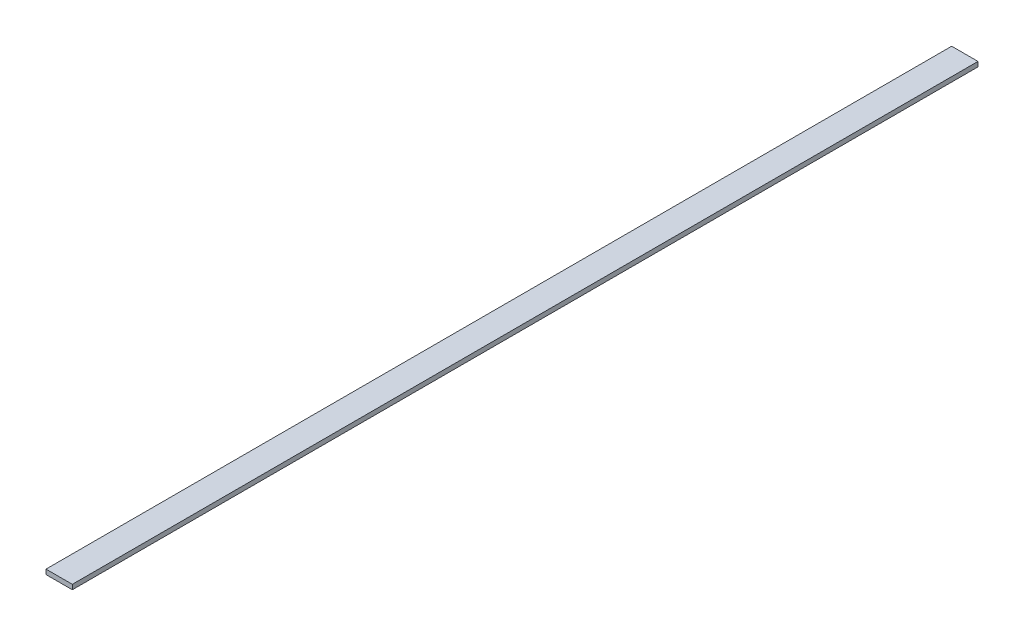
ISO-10303-21;
HEADER;
FILE_DESCRIPTION(('STEP AP214'),'2;1');
FILE_NAME('part.step','',(''),(''),'','','');
FILE_SCHEMA(('AUTOMOTIVE_DESIGN { 1 0 10303 214 1 1 1 1 }'));
ENDSEC;
DATA;
#1=APPLICATION_CONTEXT('core data for automotive mechanical design processes');
#2=APPLICATION_PROTOCOL_DEFINITION('international standard','automotive_design',2000,#1);
#3=PRODUCT_CONTEXT('',#1,'mechanical');
#4=PRODUCT('Part','Part','',(#3));
#5=PRODUCT_RELATED_PRODUCT_CATEGORY('part','',(#4));
#6=PRODUCT_DEFINITION_FORMATION('','',#4);
#7=PRODUCT_DEFINITION_CONTEXT('part definition',#1,'design');
#8=PRODUCT_DEFINITION('design','',#6,#7);
#9=PRODUCT_DEFINITION_SHAPE('','',#8);
#10=(LENGTH_UNIT() NAMED_UNIT(*) SI_UNIT(.MILLI.,.METRE.));
#11=(NAMED_UNIT(*) PLANE_ANGLE_UNIT() SI_UNIT($,.RADIAN.));
#12=(NAMED_UNIT(*) SI_UNIT($,.STERADIAN.) SOLID_ANGLE_UNIT());
#13=UNCERTAINTY_MEASURE_WITH_UNIT(LENGTH_MEASURE(1.E-05),#10,'distance_accuracy_value','');
#14=(GEOMETRIC_REPRESENTATION_CONTEXT(3) GLOBAL_UNCERTAINTY_ASSIGNED_CONTEXT((#13)) GLOBAL_UNIT_ASSIGNED_CONTEXT((#10,
#11,#12)) REPRESENTATION_CONTEXT('',''));
#15=CARTESIAN_POINT('',(0.,0.,0.));
#16=DIRECTION('',(0.,0.,1.));
#17=DIRECTION('',(1.,0.,0.));
#18=AXIS2_PLACEMENT_3D('',#15,#16,#17);
#19=CARTESIAN_POINT('',(-99.22494089103,12.66904324428,16.98384983581));
#20=DIRECTION('',(2.78096345627009E-06,-0.999999999996133,0.));
#21=DIRECTION('',(0.999999999996133,2.78096345627009E-06,0.));
#22=AXIS2_PLACEMENT_3D('',#19,#20,#21);
#23=PLANE('',#22);
#24=DIRECTION('',(0.999999999996133,2.78096345627009E-06,0.));
#25=VECTOR('',#24,1.);
#26=CARTESIAN_POINT('',(-99.22494089103,12.66904324428,84.9300427918001));
#27=LINE('',#26,#25);
#28=CARTESIAN_POINT('',(-97.25,12.6690484313842,84.9300427918));
#29=VERTEX_POINT('',#28);
#30=CARTESIAN_POINT('',(-101.2,12.6690377517128,84.9300427918));
#31=VERTEX_POINT('',#30);
#32=EDGE_CURVE('E20',#29,#31,#27,.F.);
#33=ORIENTED_EDGE('',*,*,#32,.T.);
#34=DIRECTION('',(0.,0.,1.));
#35=VECTOR('',#34,1.);
#36=CARTESIAN_POINT('',(-101.2,12.6690377517128,-68.8));
#37=LINE('',#36,#35);
#38=CARTESIAN_POINT('',(-101.2,12.6690377517128,-50.96174151019));
#39=VERTEX_POINT('',#38);
#40=EDGE_CURVE('E79',#39,#31,#37,.T.);
#41=ORIENTED_EDGE('',*,*,#40,.F.);
#42=DIRECTION('',(0.999999999996133,2.78096345627009E-06,0.));
#43=VECTOR('',#42,1.);
#44=CARTESIAN_POINT('',(-99.22494089103,12.66904324428,-50.9617415101901));
#45=LINE('',#44,#43);
#46=CARTESIAN_POINT('',(-97.25,12.6690484313842,-50.96174151019));
#47=VERTEX_POINT('',#46);
#48=EDGE_CURVE('E59',#39,#47,#45,.T.);
#49=ORIENTED_EDGE('',*,*,#48,.T.);
#50=DIRECTION('',(0.,0.,1.));
#51=VECTOR('',#50,1.);
#52=CARTESIAN_POINT('',(-97.25,12.66904812625,-68.8));
#53=LINE('',#52,#51);
#54=EDGE_CURVE('E56',#47,#29,#53,.T.);
#55=ORIENTED_EDGE('',*,*,#54,.T.);
#56=EDGE_LOOP('',(#33,#41,#49,#55));
#57=FACE_BOUND('',#56,.T.);
#58=ADVANCED_FACE('F17',(#57),#23,.T.);
#59=CARTESIAN_POINT('',(-99.225,13.02566641281,84.9300427918));
#60=DIRECTION('',(0.,0.,-1.));
#61=DIRECTION('',(-1.,0.,0.));
#62=AXIS2_PLACEMENT_3D('',#59,#60,#61);
#63=PLANE('',#62);
#64=DIRECTION('',(0.,1.,0.));
#65=VECTOR('',#64,1.);
#66=CARTESIAN_POINT('',(-97.25,-54.,84.9300427918));
#67=LINE('',#66,#65);
#68=CARTESIAN_POINT('',(-97.25,13.38228408911,84.9300427918));
#69=VERTEX_POINT('',#68);
#70=EDGE_CURVE('E63',#29,#69,#67,.T.);
#71=ORIENTED_EDGE('',*,*,#70,.T.);
#72=DIRECTION('',(1.,0.,0.));
#73=VECTOR('',#72,1.);
#74=CARTESIAN_POINT('',(-99.225,13.38228408911,84.9300427918));
#75=LINE('',#74,#73);
#76=CARTESIAN_POINT('',(-101.2,13.38228408911,84.9300427918));
#77=VERTEX_POINT('',#76);
#78=EDGE_CURVE('E87',#77,#69,#75,.T.);
#79=ORIENTED_EDGE('',*,*,#78,.F.);
#80=DIRECTION('',(0.,1.,0.));
#81=VECTOR('',#80,1.);
#82=CARTESIAN_POINT('',(-101.2,-54.,84.9300427918));
#83=LINE('',#82,#81);
#84=EDGE_CURVE('E69',#31,#77,#83,.T.);
#85=ORIENTED_EDGE('',*,*,#84,.F.);
#86=ORIENTED_EDGE('',*,*,#32,.F.);
#87=EDGE_LOOP('',(#71,#79,#85,#86));
#88=FACE_BOUND('',#87,.T.);
#89=ADVANCED_FACE('F66',(#88),#63,.F.);
#90=CARTESIAN_POINT('',(-97.25,-54.,-68.8));
#91=DIRECTION('',(-1.,0.,0.));
#92=DIRECTION('',(0.,0.,1.));
#93=AXIS2_PLACEMENT_3D('',#90,#91,#92);
#94=PLANE('',#93);
#95=ORIENTED_EDGE('',*,*,#70,.F.);
#96=ORIENTED_EDGE('',*,*,#54,.F.);
#97=DIRECTION('',(0.,1.,0.));
#98=VECTOR('',#97,1.);
#99=CARTESIAN_POINT('',(-97.25,13.02566641281,-50.96174151019));
#100=LINE('',#99,#98);
#101=CARTESIAN_POINT('',(-97.25,13.38228408911,-50.96174151019));
#102=VERTEX_POINT('',#101);
#103=EDGE_CURVE('E76',#47,#102,#100,.T.);
#104=ORIENTED_EDGE('',*,*,#103,.T.);
#105=DIRECTION('',(0.,0.,1.));
#106=VECTOR('',#105,1.);
#107=CARTESIAN_POINT('',(-97.25,13.38228408911,16.98426707158));
#108=LINE('',#107,#106);
#109=EDGE_CURVE('E73',#69,#102,#108,.F.);
#110=ORIENTED_EDGE('',*,*,#109,.F.);
#111=EDGE_LOOP('',(#95,#96,#104,#110));
#112=FACE_BOUND('',#111,.T.);
#113=ADVANCED_FACE('F71',(#112),#94,.F.);
#114=CARTESIAN_POINT('',(-99.225,13.02566641281,-50.96174151019));
#115=DIRECTION('',(0.,0.,1.));
#116=DIRECTION('',(1.,0.,0.));
#117=AXIS2_PLACEMENT_3D('',#114,#115,#116);
#118=PLANE('',#117);
#119=ORIENTED_EDGE('',*,*,#103,.F.);
#120=ORIENTED_EDGE('',*,*,#48,.F.);
#121=DIRECTION('',(0.,1.,0.));
#122=VECTOR('',#121,1.);
#123=CARTESIAN_POINT('',(-101.2,-54.,-50.96174151019));
#124=LINE('',#123,#122);
#125=CARTESIAN_POINT('',(-101.2,13.38228408911,-50.96174151019));
#126=VERTEX_POINT('',#125);
#127=EDGE_CURVE('E35',#126,#39,#124,.F.);
#128=ORIENTED_EDGE('',*,*,#127,.F.);
#129=DIRECTION('',(1.,0.,0.));
#130=VECTOR('',#129,1.);
#131=CARTESIAN_POINT('',(-99.225,13.38228408911,-50.96174151019));
#132=LINE('',#131,#130);
#133=EDGE_CURVE('E26',#102,#126,#132,.F.);
#134=ORIENTED_EDGE('',*,*,#133,.F.);
#135=EDGE_LOOP('',(#119,#120,#128,#134));
#136=FACE_BOUND('',#135,.T.);
#137=ADVANCED_FACE('F83',(#136),#118,.F.);
#138=CARTESIAN_POINT('',(-101.2,-54.,-68.8));
#139=DIRECTION('',(-1.,0.,0.));
#140=DIRECTION('',(0.,0.,1.));
#141=AXIS2_PLACEMENT_3D('',#138,#139,#140);
#142=PLANE('',#141);
#143=DIRECTION('',(0.,0.,1.));
#144=VECTOR('',#143,1.);
#145=CARTESIAN_POINT('',(-101.2,13.38228408911,16.98426707158));
#146=LINE('',#145,#144);
#147=EDGE_CURVE('E11',#126,#77,#146,.T.);
#148=ORIENTED_EDGE('',*,*,#147,.F.);
#149=ORIENTED_EDGE('',*,*,#127,.T.);
#150=ORIENTED_EDGE('',*,*,#40,.T.);
#151=ORIENTED_EDGE('',*,*,#84,.T.);
#152=EDGE_LOOP('',(#148,#149,#150,#151));
#153=FACE_BOUND('',#152,.T.);
#154=ADVANCED_FACE('F91',(#153),#142,.T.);
#155=CARTESIAN_POINT('',(-99.225,13.38228408911,16.98426707158));
#156=DIRECTION('',(0.,1.,0.));
#157=DIRECTION('',(0.,0.,1.));
#158=AXIS2_PLACEMENT_3D('',#155,#156,#157);
#159=PLANE('',#158);
#160=ORIENTED_EDGE('',*,*,#133,.T.);
#161=ORIENTED_EDGE('',*,*,#147,.T.);
#162=ORIENTED_EDGE('',*,*,#78,.T.);
#163=ORIENTED_EDGE('',*,*,#109,.T.);
#164=EDGE_LOOP('',(#160,#161,#162,#163));
#165=FACE_BOUND('',#164,.T.);
#166=ADVANCED_FACE('F86',(#165),#159,.T.);
#167=CLOSED_SHELL('',(#58,#89,#113,#137,#154,#166));
#168=MANIFOLD_SOLID_BREP('B1',#167);
#169=ADVANCED_BREP_SHAPE_REPRESENTATION('',(#18,#168),#14);
#170=SHAPE_DEFINITION_REPRESENTATION(#9,#169);
ENDSEC;
END-ISO-10303-21;
